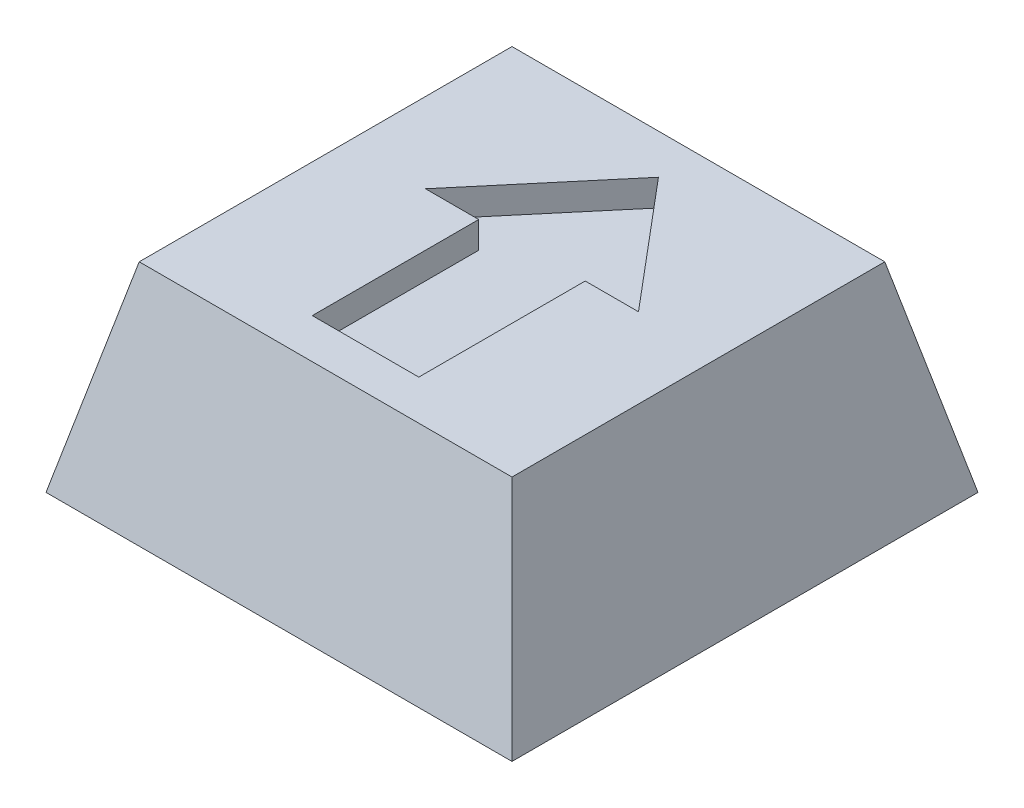
ISO-10303-21;
HEADER;
FILE_DESCRIPTION(('STEP AP214'),'2;1');
FILE_NAME('part.step','',(''),(''),'','','');
FILE_SCHEMA(('AUTOMOTIVE_DESIGN { 1 0 10303 214 1 1 1 1 }'));
ENDSEC;
DATA;
#1=APPLICATION_CONTEXT('core data for automotive mechanical design processes');
#2=APPLICATION_PROTOCOL_DEFINITION('international standard','automotive_design',2000,#1);
#3=PRODUCT_CONTEXT('',#1,'mechanical');
#4=PRODUCT('Part','Part','',(#3));
#5=PRODUCT_RELATED_PRODUCT_CATEGORY('part','',(#4));
#6=PRODUCT_DEFINITION_FORMATION('','',#4);
#7=PRODUCT_DEFINITION_CONTEXT('part definition',#1,'design');
#8=PRODUCT_DEFINITION('design','',#6,#7);
#9=PRODUCT_DEFINITION_SHAPE('','',#8);
#10=(LENGTH_UNIT() NAMED_UNIT(*) SI_UNIT(.MILLI.,.METRE.));
#11=(NAMED_UNIT(*) PLANE_ANGLE_UNIT() SI_UNIT($,.RADIAN.));
#12=(NAMED_UNIT(*) SI_UNIT($,.STERADIAN.) SOLID_ANGLE_UNIT());
#13=UNCERTAINTY_MEASURE_WITH_UNIT(LENGTH_MEASURE(1.E-05),#10,'distance_accuracy_value','');
#14=(GEOMETRIC_REPRESENTATION_CONTEXT(3) GLOBAL_UNCERTAINTY_ASSIGNED_CONTEXT((#13)) GLOBAL_UNIT_ASSIGNED_CONTEXT((#10,
#11,#12)) REPRESENTATION_CONTEXT('',''));
#15=CARTESIAN_POINT('',(0.,0.,0.));
#16=DIRECTION('',(0.,0.,1.));
#17=DIRECTION('',(1.,0.,0.));
#18=AXIS2_PLACEMENT_3D('',#15,#16,#17);
#19=CARTESIAN_POINT('',(0.,3.,0.));
#20=DIRECTION('',(0.,-1.,0.));
#21=DIRECTION('',(0.,0.,-1.));
#22=AXIS2_PLACEMENT_3D('',#19,#20,#21);
#23=PLANE('',#22);
#24=DIRECTION('',(1.,0.,0.));
#25=VECTOR('',#24,1.);
#26=CARTESIAN_POINT('',(0.,3.,-3.8));
#27=LINE('',#26,#25);
#28=CARTESIAN_POINT('',(1.9,3.,-3.8));
#29=VERTEX_POINT('',#28);
#30=CARTESIAN_POINT('',(2.7,3.,-3.8));
#31=VERTEX_POINT('',#30);
#32=EDGE_CURVE('E170',#29,#31,#27,.T.);
#33=ORIENTED_EDGE('',*,*,#32,.F.);
#34=DIRECTION('',(-0.64413574578278,0.,0.764911198117051));
#35=VECTOR('',#34,1.);
#36=CARTESIAN_POINT('',(-0.760615883306323,3.,-0.640518638573746));
#37=LINE('',#36,#35);
#38=CARTESIAN_POINT('',(3.5,3.,-5.7));
#39=VERTEX_POINT('',#38);
#40=EDGE_CURVE('E58',#39,#29,#37,.T.);
#41=ORIENTED_EDGE('',*,*,#40,.F.);
#42=DIRECTION('',(-0.64413574578278,0.,-0.764911198117051));
#43=VECTOR('',#42,1.);
#44=CARTESIAN_POINT('',(4.85623987034035,3.,-4.08946515397083));
#45=LINE('',#44,#43);
#46=CARTESIAN_POINT('',(5.1,3.,-3.8));
#47=VERTEX_POINT('',#46);
#48=EDGE_CURVE('E150',#47,#39,#45,.T.);
#49=ORIENTED_EDGE('',*,*,#48,.F.);
#50=CARTESIAN_POINT('',(4.3,3.,-3.8));
#51=VERTEX_POINT('',#50);
#52=EDGE_CURVE('E154',#51,#47,#27,.T.);
#53=ORIENTED_EDGE('',*,*,#52,.F.);
#54=DIRECTION('',(0.,0.,1.));
#55=VECTOR('',#54,1.);
#56=CARTESIAN_POINT('',(4.3,3.,0.));
#57=LINE('',#56,#55);
#58=CARTESIAN_POINT('',(4.3,3.,-1.3));
#59=VERTEX_POINT('',#58);
#60=EDGE_CURVE('E181',#51,#59,#57,.T.);
#61=ORIENTED_EDGE('',*,*,#60,.T.);
#62=DIRECTION('',(1.,0.,0.));
#63=VECTOR('',#62,1.);
#64=CARTESIAN_POINT('',(0.,3.,-1.3));
#65=LINE('',#64,#63);
#66=CARTESIAN_POINT('',(2.7,3.,-1.3));
#67=VERTEX_POINT('',#66);
#68=EDGE_CURVE('E177',#67,#59,#65,.T.);
#69=ORIENTED_EDGE('',*,*,#68,.F.);
#70=DIRECTION('',(0.,0.,1.));
#71=VECTOR('',#70,1.);
#72=CARTESIAN_POINT('',(2.7,3.,0.));
#73=LINE('',#72,#71);
#74=EDGE_CURVE('E173',#31,#67,#73,.T.);
#75=ORIENTED_EDGE('',*,*,#74,.F.);
#76=EDGE_LOOP('',(#33,#41,#49,#53,#61,#69,#75));
#77=FACE_BOUND('',#76,.T.);
#78=DIRECTION('',(-1.,0.,0.));
#79=VECTOR('',#78,1.);
#80=CARTESIAN_POINT('',(11.,3.,-0.7));
#81=LINE('',#80,#79);
#82=CARTESIAN_POINT('',(6.3,3.,-0.7));
#83=VERTEX_POINT('',#82);
#84=CARTESIAN_POINT('',(0.7,3.,-0.7));
#85=VERTEX_POINT('',#84);
#86=EDGE_CURVE('E65',#83,#85,#81,.T.);
#87=ORIENTED_EDGE('',*,*,#86,.F.);
#88=DIRECTION('',(0.,0.,1.));
#89=VECTOR('',#88,1.);
#90=CARTESIAN_POINT('',(6.3,3.,-7.));
#91=LINE('',#90,#89);
#92=CARTESIAN_POINT('',(6.3,3.,-6.3));
#93=VERTEX_POINT('',#92);
#94=EDGE_CURVE('E222',#93,#83,#91,.T.);
#95=ORIENTED_EDGE('',*,*,#94,.F.);
#96=DIRECTION('',(-1.,0.,0.));
#97=VECTOR('',#96,1.);
#98=CARTESIAN_POINT('',(11.,3.,-6.3));
#99=LINE('',#98,#97);
#100=CARTESIAN_POINT('',(0.699999999999998,3.,-6.3));
#101=VERTEX_POINT('',#100);
#102=EDGE_CURVE('E207',#93,#101,#99,.T.);
#103=ORIENTED_EDGE('',*,*,#102,.T.);
#104=DIRECTION('',(0.,0.,1.));
#105=VECTOR('',#104,1.);
#106=CARTESIAN_POINT('',(0.7,3.,-7.));
#107=LINE('',#106,#105);
#108=EDGE_CURVE('E223',#101,#85,#107,.T.);
#109=ORIENTED_EDGE('',*,*,#108,.T.);
#110=EDGE_LOOP('',(#87,#95,#103,#109));
#111=FACE_BOUND('',#110,.T.);
#112=ADVANCED_FACE('F42',(#77,#111),#23,.F.);
#113=CARTESIAN_POINT('',(7.,0.,-7.));
#114=DIRECTION('',(-0.973841209741793,-0.227229615606418,0.));
#115=DIRECTION('',(0.227229615606418,-0.973841209741793,0.));
#116=AXIS2_PLACEMENT_3D('',#113,#114,#115);
#117=PLANE('',#116);
#118=DIRECTION('',(-0.221581128241521,0.949633406749377,-0.221581128241521));
#119=VECTOR('',#118,1.);
#120=CARTESIAN_POINT('',(6.6563126252505,1.47294589178357,-0.343687374749499));
#121=LINE('',#120,#119);
#122=CARTESIAN_POINT('',(7.,0.,0.));
#123=VERTEX_POINT('',#122);
#124=EDGE_CURVE('E219',#123,#83,#121,.T.);
#125=ORIENTED_EDGE('',*,*,#124,.F.);
#126=DIRECTION('',(0.,0.,-1.));
#127=VECTOR('',#126,1.);
#128=CARTESIAN_POINT('',(7.,0.,0.));
#129=LINE('',#128,#127);
#130=CARTESIAN_POINT('',(7.,0.,-7.));
#131=VERTEX_POINT('',#130);
#132=EDGE_CURVE('E237',#123,#131,#129,.T.);
#133=ORIENTED_EDGE('',*,*,#132,.T.);
#134=DIRECTION('',(0.221581128241521,-0.949633406749377,-0.221581128241521));
#135=VECTOR('',#134,1.);
#136=CARTESIAN_POINT('',(7.,0.,-7.));
#137=LINE('',#136,#135);
#138=EDGE_CURVE('E213',#93,#131,#137,.T.);
#139=ORIENTED_EDGE('',*,*,#138,.F.);
#140=ORIENTED_EDGE('',*,*,#94,.T.);
#141=EDGE_LOOP('',(#125,#133,#139,#140));
#142=FACE_BOUND('',#141,.T.);
#143=ADVANCED_FACE('F261',(#142),#117,.F.);
#144=CARTESIAN_POINT('',(0.,0.,-7.));
#145=DIRECTION('',(0.973841209741793,-0.227229615606418,0.));
#146=DIRECTION('',(0.227229615606418,0.973841209741793,0.));
#147=AXIS2_PLACEMENT_3D('',#144,#145,#146);
#148=PLANE('',#147);
#149=DIRECTION('',(-0.221581128241521,-0.949633406749378,0.221581128241521));
#150=VECTOR('',#149,1.);
#151=CARTESIAN_POINT('',(0.343687374749499,1.47294589178357,-0.3436873747495));
#152=LINE('',#151,#150);
#153=CARTESIAN_POINT('',(0.,0.,0.));
#154=VERTEX_POINT('',#153);
#155=EDGE_CURVE('E11',#85,#154,#152,.T.);
#156=ORIENTED_EDGE('',*,*,#155,.F.);
#157=ORIENTED_EDGE('',*,*,#108,.F.);
#158=DIRECTION('',(0.221581128241521,0.949633406749377,0.221581128241521));
#159=VECTOR('',#158,1.);
#160=CARTESIAN_POINT('',(0.,0.,-7.));
#161=LINE('',#160,#159);
#162=CARTESIAN_POINT('',(0.,0.,-7.));
#163=VERTEX_POINT('',#162);
#164=EDGE_CURVE('E51',#163,#101,#161,.T.);
#165=ORIENTED_EDGE('',*,*,#164,.F.);
#166=DIRECTION('',(0.,0.,1.));
#167=VECTOR('',#166,1.);
#168=CARTESIAN_POINT('',(0.,0.,0.));
#169=LINE('',#168,#167);
#170=EDGE_CURVE('E227',#163,#154,#169,.T.);
#171=ORIENTED_EDGE('',*,*,#170,.T.);
#172=EDGE_LOOP('',(#156,#157,#165,#171));
#173=FACE_BOUND('',#172,.T.);
#174=ADVANCED_FACE('F254',(#173),#148,.F.);
#175=CARTESIAN_POINT('',(0.,0.,0.));
#176=DIRECTION('',(0.,-1.,0.));
#177=DIRECTION('',(0.,0.,-1.));
#178=AXIS2_PLACEMENT_3D('',#175,#176,#177);
#179=PLANE('',#178);
#180=CARTESIAN_POINT('',(3.5,0.,-3.5));
#181=DIRECTION('',(0.,-1.,0.));
#182=DIRECTION('',(0.,0.,-1.));
#183=AXIS2_PLACEMENT_3D('',#180,#181,#182);
#184=CIRCLE('',#183,1.8);
#185=CARTESIAN_POINT('',(3.5,0.,-5.3));
#186=VERTEX_POINT('',#185);
#187=EDGE_CURVE('E188',#186,#186,#184,.T.);
#188=ORIENTED_EDGE('',*,*,#187,.F.);
#189=EDGE_LOOP('',(#188));
#190=FACE_BOUND('',#189,.T.);
#191=ORIENTED_EDGE('',*,*,#170,.F.);
#192=DIRECTION('',(-1.,0.,0.));
#193=VECTOR('',#192,1.);
#194=CARTESIAN_POINT('',(0.,0.,-7.));
#195=LINE('',#194,#193);
#196=EDGE_CURVE('E241',#131,#163,#195,.T.);
#197=ORIENTED_EDGE('',*,*,#196,.F.);
#198=ORIENTED_EDGE('',*,*,#132,.F.);
#199=DIRECTION('',(1.,0.,0.));
#200=VECTOR('',#199,1.);
#201=CARTESIAN_POINT('',(0.,0.,0.));
#202=LINE('',#201,#200);
#203=EDGE_CURVE('E234',#154,#123,#202,.T.);
#204=ORIENTED_EDGE('',*,*,#203,.F.);
#205=EDGE_LOOP('',(#191,#197,#198,#204));
#206=FACE_BOUND('',#205,.T.);
#207=ADVANCED_FACE('F44',(#190,#206),#179,.T.);
#208=CARTESIAN_POINT('',(11.,3.,-6.3));
#209=DIRECTION('',(0.,0.227229615606418,-0.973841209741793));
#210=DIRECTION('',(0.,0.973841209741793,0.227229615606418));
#211=AXIS2_PLACEMENT_3D('',#208,#209,#210);
#212=PLANE('',#211);
#213=ORIENTED_EDGE('',*,*,#138,.T.);
#214=ORIENTED_EDGE('',*,*,#196,.T.);
#215=ORIENTED_EDGE('',*,*,#164,.T.);
#216=ORIENTED_EDGE('',*,*,#102,.F.);
#217=EDGE_LOOP('',(#213,#214,#215,#216));
#218=FACE_BOUND('',#217,.T.);
#219=ADVANCED_FACE('F246',(#218),#212,.T.);
#220=CARTESIAN_POINT('',(11.,0.,0.));
#221=DIRECTION('',(0.,0.227229615606418,0.973841209741793));
#222=DIRECTION('',(0.,-0.973841209741793,0.227229615606418));
#223=AXIS2_PLACEMENT_3D('',#220,#221,#222);
#224=PLANE('',#223);
#225=ORIENTED_EDGE('',*,*,#124,.T.);
#226=ORIENTED_EDGE('',*,*,#86,.T.);
#227=ORIENTED_EDGE('',*,*,#155,.T.);
#228=ORIENTED_EDGE('',*,*,#203,.T.);
#229=EDGE_LOOP('',(#225,#226,#227,#228));
#230=FACE_BOUND('',#229,.T.);
#231=ADVANCED_FACE('F256',(#230),#224,.T.);
#232=CARTESIAN_POINT('',(3.5,0.8,-3.5));
#233=DIRECTION('',(0.,-1.,0.));
#234=DIRECTION('',(0.,0.,-1.));
#235=AXIS2_PLACEMENT_3D('',#232,#233,#234);
#236=CYLINDRICAL_SURFACE('',#235,1.8);
#237=CARTESIAN_POINT('',(3.5,0.8,-3.5));
#238=DIRECTION('',(0.,-1.,0.));
#239=DIRECTION('',(0.,0.,-1.));
#240=AXIS2_PLACEMENT_3D('',#237,#238,#239);
#241=CIRCLE('',#240,1.8);
#242=CARTESIAN_POINT('',(3.5,0.8,-5.3));
#243=VERTEX_POINT('',#242);
#244=EDGE_CURVE('E203',#243,#243,#241,.T.);
#245=ORIENTED_EDGE('',*,*,#244,.F.);
#246=EDGE_LOOP('',(#245));
#247=FACE_BOUND('',#246,.T.);
#248=ORIENTED_EDGE('',*,*,#187,.T.);
#249=EDGE_LOOP('',(#248));
#250=FACE_BOUND('',#249,.T.);
#251=ADVANCED_FACE('F282',(#247,#250),#236,.F.);
#252=CARTESIAN_POINT('',(3.5,0.8,-3.5));
#253=DIRECTION('',(0.,-1.,0.));
#254=DIRECTION('',(0.,0.,-1.));
#255=AXIS2_PLACEMENT_3D('',#252,#253,#254);
#256=PLANE('',#255);
#257=ORIENTED_EDGE('',*,*,#244,.T.);
#258=EDGE_LOOP('',(#257));
#259=FACE_BOUND('',#258,.T.);
#260=ADVANCED_FACE('F285',(#259),#256,.T.);
#261=CARTESIAN_POINT('',(-0.760615883306323,2.6,-0.640518638573746));
#262=DIRECTION('',(-0.764911198117051,0.,-0.64413574578278));
#263=DIRECTION('',(-0.64413574578278,0.,0.764911198117051));
#264=AXIS2_PLACEMENT_3D('',#261,#262,#263);
#265=PLANE('',#264);
#266=ORIENTED_EDGE('',*,*,#40,.T.);
#267=DIRECTION('',(0.,1.,0.));
#268=VECTOR('',#267,1.);
#269=CARTESIAN_POINT('',(1.9,2.6,-3.8));
#270=LINE('',#269,#268);
#271=CARTESIAN_POINT('',(1.9,2.6,-3.8));
#272=VERTEX_POINT('',#271);
#273=EDGE_CURVE('E123',#272,#29,#270,.T.);
#274=ORIENTED_EDGE('',*,*,#273,.F.);
#275=DIRECTION('',(-0.64413574578278,0.,0.764911198117051));
#276=VECTOR('',#275,1.);
#277=CARTESIAN_POINT('',(-0.760615883306323,2.6,-0.640518638573746));
#278=LINE('',#277,#276);
#279=CARTESIAN_POINT('',(3.5,2.6,-5.7));
#280=VERTEX_POINT('',#279);
#281=EDGE_CURVE('E127',#280,#272,#278,.T.);
#282=ORIENTED_EDGE('',*,*,#281,.F.);
#283=DIRECTION('',(0.,1.,0.));
#284=VECTOR('',#283,1.);
#285=CARTESIAN_POINT('',(3.5,2.6,-5.7));
#286=LINE('',#285,#284);
#287=EDGE_CURVE('E185',#280,#39,#286,.T.);
#288=ORIENTED_EDGE('',*,*,#287,.T.);
#289=EDGE_LOOP('',(#266,#274,#282,#288));
#290=FACE_BOUND('',#289,.T.);
#291=ADVANCED_FACE('F125',(#290),#265,.F.);
#292=CARTESIAN_POINT('',(4.85623987034035,2.6,-4.08946515397083));
#293=DIRECTION('',(0.764911198117051,0.,-0.64413574578278));
#294=DIRECTION('',(-0.64413574578278,0.,-0.764911198117051));
#295=AXIS2_PLACEMENT_3D('',#292,#293,#294);
#296=PLANE('',#295);
#297=ORIENTED_EDGE('',*,*,#48,.T.);
#298=ORIENTED_EDGE('',*,*,#287,.F.);
#299=DIRECTION('',(-0.64413574578278,0.,-0.764911198117051));
#300=VECTOR('',#299,1.);
#301=CARTESIAN_POINT('',(4.85623987034035,2.6,-4.08946515397083));
#302=LINE('',#301,#300);
#303=CARTESIAN_POINT('',(5.1,2.6,-3.8));
#304=VERTEX_POINT('',#303);
#305=EDGE_CURVE('E134',#304,#280,#302,.T.);
#306=ORIENTED_EDGE('',*,*,#305,.F.);
#307=DIRECTION('',(0.,1.,0.));
#308=VECTOR('',#307,1.);
#309=CARTESIAN_POINT('',(5.1,2.6,-3.8));
#310=LINE('',#309,#308);
#311=EDGE_CURVE('E189',#304,#47,#310,.T.);
#312=ORIENTED_EDGE('',*,*,#311,.T.);
#313=EDGE_LOOP('',(#297,#298,#306,#312));
#314=FACE_BOUND('',#313,.T.);
#315=ADVANCED_FACE('F292',(#314),#296,.F.);
#316=CARTESIAN_POINT('',(0.,2.6,-3.8));
#317=DIRECTION('',(0.,0.,1.));
#318=DIRECTION('',(1.,0.,0.));
#319=AXIS2_PLACEMENT_3D('',#316,#317,#318);
#320=PLANE('',#319);
#321=ORIENTED_EDGE('',*,*,#52,.T.);
#322=ORIENTED_EDGE('',*,*,#311,.F.);
#323=DIRECTION('',(1.,0.,0.));
#324=VECTOR('',#323,1.);
#325=CARTESIAN_POINT('',(0.,2.6,-3.8));
#326=LINE('',#325,#324);
#327=CARTESIAN_POINT('',(4.3,2.6,-3.8));
#328=VERTEX_POINT('',#327);
#329=EDGE_CURVE('E145',#328,#304,#326,.T.);
#330=ORIENTED_EDGE('',*,*,#329,.F.);
#331=DIRECTION('',(0.,1.,0.));
#332=VECTOR('',#331,1.);
#333=CARTESIAN_POINT('',(4.3,2.6,-3.8));
#334=LINE('',#333,#332);
#335=EDGE_CURVE('E192',#328,#51,#334,.T.);
#336=ORIENTED_EDGE('',*,*,#335,.T.);
#337=EDGE_LOOP('',(#321,#322,#330,#336));
#338=FACE_BOUND('',#337,.T.);
#339=ADVANCED_FACE('F304',(#338),#320,.F.);
#340=CARTESIAN_POINT('',(4.3,2.6,0.));
#341=DIRECTION('',(-1.,0.,0.));
#342=DIRECTION('',(0.,0.,1.));
#343=AXIS2_PLACEMENT_3D('',#340,#341,#342);
#344=PLANE('',#343);
#345=ORIENTED_EDGE('',*,*,#60,.F.);
#346=ORIENTED_EDGE('',*,*,#335,.F.);
#347=DIRECTION('',(0.,0.,1.));
#348=VECTOR('',#347,1.);
#349=CARTESIAN_POINT('',(4.3,2.6,0.));
#350=LINE('',#349,#348);
#351=CARTESIAN_POINT('',(4.3,2.6,-1.3));
#352=VERTEX_POINT('',#351);
#353=EDGE_CURVE('E163',#328,#352,#350,.T.);
#354=ORIENTED_EDGE('',*,*,#353,.T.);
#355=DIRECTION('',(0.,1.,0.));
#356=VECTOR('',#355,1.);
#357=CARTESIAN_POINT('',(4.3,2.6,-1.3));
#358=LINE('',#357,#356);
#359=EDGE_CURVE('E195',#352,#59,#358,.T.);
#360=ORIENTED_EDGE('',*,*,#359,.T.);
#361=EDGE_LOOP('',(#345,#346,#354,#360));
#362=FACE_BOUND('',#361,.T.);
#363=ADVANCED_FACE('F300',(#362),#344,.T.);
#364=CARTESIAN_POINT('',(0.,2.6,-1.3));
#365=DIRECTION('',(0.,0.,1.));
#366=DIRECTION('',(1.,0.,0.));
#367=AXIS2_PLACEMENT_3D('',#364,#365,#366);
#368=PLANE('',#367);
#369=ORIENTED_EDGE('',*,*,#68,.T.);
#370=ORIENTED_EDGE('',*,*,#359,.F.);
#371=DIRECTION('',(1.,0.,0.));
#372=VECTOR('',#371,1.);
#373=CARTESIAN_POINT('',(0.,2.6,-1.3));
#374=LINE('',#373,#372);
#375=CARTESIAN_POINT('',(2.7,2.6,-1.3));
#376=VERTEX_POINT('',#375);
#377=EDGE_CURVE('E159',#376,#352,#374,.T.);
#378=ORIENTED_EDGE('',*,*,#377,.F.);
#379=DIRECTION('',(0.,1.,0.));
#380=VECTOR('',#379,1.);
#381=CARTESIAN_POINT('',(2.7,2.6,-1.3));
#382=LINE('',#381,#380);
#383=EDGE_CURVE('E198',#376,#67,#382,.T.);
#384=ORIENTED_EDGE('',*,*,#383,.T.);
#385=EDGE_LOOP('',(#369,#370,#378,#384));
#386=FACE_BOUND('',#385,.T.);
#387=ADVANCED_FACE('F296',(#386),#368,.F.);
#388=CARTESIAN_POINT('',(2.7,2.6,0.));
#389=DIRECTION('',(-1.,0.,0.));
#390=DIRECTION('',(0.,0.,1.));
#391=AXIS2_PLACEMENT_3D('',#388,#389,#390);
#392=PLANE('',#391);
#393=ORIENTED_EDGE('',*,*,#74,.T.);
#394=ORIENTED_EDGE('',*,*,#383,.F.);
#395=DIRECTION('',(0.,0.,1.));
#396=VECTOR('',#395,1.);
#397=CARTESIAN_POINT('',(2.7,2.6,0.));
#398=LINE('',#397,#396);
#399=CARTESIAN_POINT('',(2.7,2.6,-3.8));
#400=VERTEX_POINT('',#399);
#401=EDGE_CURVE('E143',#400,#376,#398,.T.);
#402=ORIENTED_EDGE('',*,*,#401,.F.);
#403=DIRECTION('',(0.,1.,0.));
#404=VECTOR('',#403,1.);
#405=CARTESIAN_POINT('',(2.7,2.6,-3.8));
#406=LINE('',#405,#404);
#407=EDGE_CURVE('E133',#400,#31,#406,.T.);
#408=ORIENTED_EDGE('',*,*,#407,.T.);
#409=EDGE_LOOP('',(#393,#394,#402,#408));
#410=FACE_BOUND('',#409,.T.);
#411=ADVANCED_FACE('F293',(#410),#392,.F.);
#412=ORIENTED_EDGE('',*,*,#32,.T.);
#413=ORIENTED_EDGE('',*,*,#407,.F.);
#414=EDGE_CURVE('E137',#272,#400,#326,.T.);
#415=ORIENTED_EDGE('',*,*,#414,.F.);
#416=ORIENTED_EDGE('',*,*,#273,.T.);
#417=EDGE_LOOP('',(#412,#413,#415,#416));
#418=FACE_BOUND('',#417,.T.);
#419=ADVANCED_FACE('F138',(#418),#320,.F.);
#420=CARTESIAN_POINT('',(0.,2.6,0.));
#421=DIRECTION('',(0.,1.,0.));
#422=DIRECTION('',(0.,0.,1.));
#423=AXIS2_PLACEMENT_3D('',#420,#421,#422);
#424=PLANE('',#423);
#425=ORIENTED_EDGE('',*,*,#281,.T.);
#426=ORIENTED_EDGE('',*,*,#414,.T.);
#427=ORIENTED_EDGE('',*,*,#401,.T.);
#428=ORIENTED_EDGE('',*,*,#377,.T.);
#429=ORIENTED_EDGE('',*,*,#353,.F.);
#430=ORIENTED_EDGE('',*,*,#329,.T.);
#431=ORIENTED_EDGE('',*,*,#305,.T.);
#432=EDGE_LOOP('',(#425,#426,#427,#428,#429,#430,#431));
#433=FACE_BOUND('',#432,.T.);
#434=ADVANCED_FACE('F146',(#433),#424,.T.);
#435=CLOSED_SHELL('',(#112,#143,#174,#207,#219,#231,#251,#260,#291,#315,#339,#363,#387,#411,
#419,#434));
#436=MANIFOLD_SOLID_BREP('B2',#435);
#437=ADVANCED_BREP_SHAPE_REPRESENTATION('',(#18,#436),#14);
#438=SHAPE_DEFINITION_REPRESENTATION(#9,#437);
ENDSEC;
END-ISO-10303-21;
